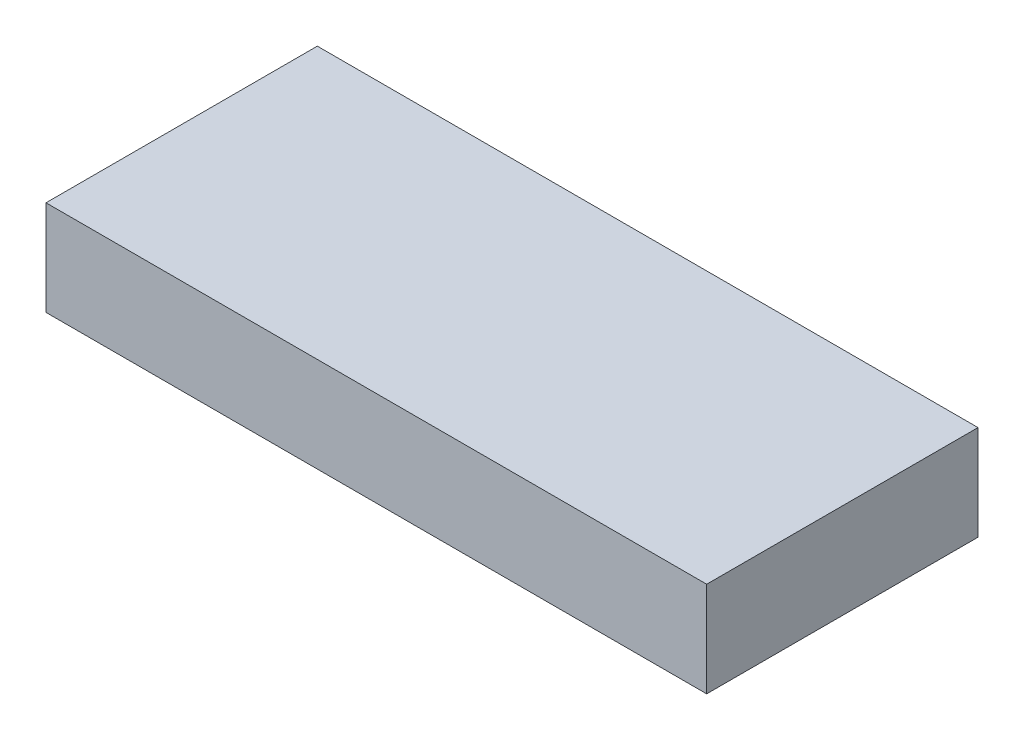
ISO-10303-21;
HEADER;
FILE_DESCRIPTION(('STEP AP214'),'2;1');
FILE_NAME('part.step','',(''),(''),'','','');
FILE_SCHEMA(('AUTOMOTIVE_DESIGN { 1 0 10303 214 1 1 1 1 }'));
ENDSEC;
DATA;
#1=APPLICATION_CONTEXT('core data for automotive mechanical design processes');
#2=APPLICATION_PROTOCOL_DEFINITION('international standard','automotive_design',2000,#1);
#3=PRODUCT_CONTEXT('',#1,'mechanical');
#4=PRODUCT('Part','Part','',(#3));
#5=PRODUCT_RELATED_PRODUCT_CATEGORY('part','',(#4));
#6=PRODUCT_DEFINITION_FORMATION('','',#4);
#7=PRODUCT_DEFINITION_CONTEXT('part definition',#1,'design');
#8=PRODUCT_DEFINITION('design','',#6,#7);
#9=PRODUCT_DEFINITION_SHAPE('','',#8);
#10=(LENGTH_UNIT() NAMED_UNIT(*) SI_UNIT(.MILLI.,.METRE.));
#11=(NAMED_UNIT(*) PLANE_ANGLE_UNIT() SI_UNIT($,.RADIAN.));
#12=(NAMED_UNIT(*) SI_UNIT($,.STERADIAN.) SOLID_ANGLE_UNIT());
#13=UNCERTAINTY_MEASURE_WITH_UNIT(LENGTH_MEASURE(1.E-05),#10,'distance_accuracy_value','');
#14=(GEOMETRIC_REPRESENTATION_CONTEXT(3) GLOBAL_UNCERTAINTY_ASSIGNED_CONTEXT((#13)) GLOBAL_UNIT_ASSIGNED_CONTEXT((#10,
#11,#12)) REPRESENTATION_CONTEXT('',''));
#15=CARTESIAN_POINT('',(0.,0.,0.));
#16=DIRECTION('',(0.,0.,1.));
#17=DIRECTION('',(1.,0.,0.));
#18=AXIS2_PLACEMENT_3D('',#15,#16,#17);
#19=CARTESIAN_POINT('',(0.,5.334,0.));
#20=DIRECTION('',(1.,0.,0.));
#21=DIRECTION('',(0.,0.,-1.));
#22=AXIS2_PLACEMENT_3D('',#19,#20,#21);
#23=PLANE('',#22);
#24=DIRECTION('',(0.,0.,1.));
#25=VECTOR('',#24,1.);
#26=CARTESIAN_POINT('',(0.,0.,0.));
#27=LINE('',#26,#25);
#28=CARTESIAN_POINT('',(0.,0.,-15.24));
#29=VERTEX_POINT('',#28);
#30=CARTESIAN_POINT('',(0.,0.,0.));
#31=VERTEX_POINT('',#30);
#32=EDGE_CURVE('E96',#29,#31,#27,.T.);
#33=ORIENTED_EDGE('',*,*,#32,.T.);
#34=DIRECTION('',(0.,-1.,0.));
#35=VECTOR('',#34,1.);
#36=CARTESIAN_POINT('',(0.,5.334,0.));
#37=LINE('',#36,#35);
#38=CARTESIAN_POINT('',(0.,5.334,0.));
#39=VERTEX_POINT('',#38);
#40=EDGE_CURVE('E11',#39,#31,#37,.T.);
#41=ORIENTED_EDGE('',*,*,#40,.F.);
#42=DIRECTION('',(0.,0.,1.));
#43=VECTOR('',#42,1.);
#44=CARTESIAN_POINT('',(0.,5.334,0.));
#45=LINE('',#44,#43);
#46=CARTESIAN_POINT('',(0.,5.334,-15.24));
#47=VERTEX_POINT('',#46);
#48=EDGE_CURVE('E84',#47,#39,#45,.T.);
#49=ORIENTED_EDGE('',*,*,#48,.F.);
#50=DIRECTION('',(0.,-1.,0.));
#51=VECTOR('',#50,1.);
#52=CARTESIAN_POINT('',(0.,5.334,-15.24));
#53=LINE('',#52,#51);
#54=EDGE_CURVE('E92',#47,#29,#53,.T.);
#55=ORIENTED_EDGE('',*,*,#54,.T.);
#56=EDGE_LOOP('',(#33,#41,#49,#55));
#57=FACE_BOUND('',#56,.T.);
#58=ADVANCED_FACE('F33',(#57),#23,.F.);
#59=CARTESIAN_POINT('',(0.,5.334,0.));
#60=DIRECTION('',(0.,0.,-1.));
#61=DIRECTION('',(-1.,0.,0.));
#62=AXIS2_PLACEMENT_3D('',#59,#60,#61);
#63=PLANE('',#62);
#64=DIRECTION('',(1.,0.,0.));
#65=VECTOR('',#64,1.);
#66=CARTESIAN_POINT('',(0.,0.,0.));
#67=LINE('',#66,#65);
#68=CARTESIAN_POINT('',(37.1094,0.,0.));
#69=VERTEX_POINT('',#68);
#70=EDGE_CURVE('E88',#31,#69,#67,.T.);
#71=ORIENTED_EDGE('',*,*,#70,.T.);
#72=DIRECTION('',(0.,-1.,0.));
#73=VECTOR('',#72,1.);
#74=CARTESIAN_POINT('',(37.1094,5.334,0.));
#75=LINE('',#74,#73);
#76=CARTESIAN_POINT('',(37.1094,5.334,0.));
#77=VERTEX_POINT('',#76);
#78=EDGE_CURVE('E41',#77,#69,#75,.T.);
#79=ORIENTED_EDGE('',*,*,#78,.F.);
#80=DIRECTION('',(1.,0.,0.));
#81=VECTOR('',#80,1.);
#82=CARTESIAN_POINT('',(0.,5.334,0.));
#83=LINE('',#82,#81);
#84=EDGE_CURVE('E79',#39,#77,#83,.T.);
#85=ORIENTED_EDGE('',*,*,#84,.F.);
#86=ORIENTED_EDGE('',*,*,#40,.T.);
#87=EDGE_LOOP('',(#71,#79,#85,#86));
#88=FACE_BOUND('',#87,.T.);
#89=ADVANCED_FACE('F87',(#88),#63,.F.);
#90=CARTESIAN_POINT('',(37.1094,5.334,0.));
#91=DIRECTION('',(-1.,0.,0.));
#92=DIRECTION('',(0.,0.,1.));
#93=AXIS2_PLACEMENT_3D('',#90,#91,#92);
#94=PLANE('',#93);
#95=DIRECTION('',(0.,0.,-1.));
#96=VECTOR('',#95,1.);
#97=CARTESIAN_POINT('',(37.1094,0.,0.));
#98=LINE('',#97,#96);
#99=CARTESIAN_POINT('',(37.1094,0.,-15.24));
#100=VERTEX_POINT('',#99);
#101=EDGE_CURVE('E66',#69,#100,#98,.T.);
#102=ORIENTED_EDGE('',*,*,#101,.T.);
#103=DIRECTION('',(0.,-1.,0.));
#104=VECTOR('',#103,1.);
#105=CARTESIAN_POINT('',(37.1094,5.334,-15.24));
#106=LINE('',#105,#104);
#107=CARTESIAN_POINT('',(37.1094,5.334,-15.24));
#108=VERTEX_POINT('',#107);
#109=EDGE_CURVE('E89',#108,#100,#106,.T.);
#110=ORIENTED_EDGE('',*,*,#109,.F.);
#111=DIRECTION('',(0.,0.,-1.));
#112=VECTOR('',#111,1.);
#113=CARTESIAN_POINT('',(37.1094,5.334,0.));
#114=LINE('',#113,#112);
#115=EDGE_CURVE('E82',#77,#108,#114,.T.);
#116=ORIENTED_EDGE('',*,*,#115,.F.);
#117=ORIENTED_EDGE('',*,*,#78,.T.);
#118=EDGE_LOOP('',(#102,#110,#116,#117));
#119=FACE_BOUND('',#118,.T.);
#120=ADVANCED_FACE('F90',(#119),#94,.F.);
#121=CARTESIAN_POINT('',(0.,5.334,-15.24));
#122=DIRECTION('',(0.,0.,1.));
#123=DIRECTION('',(1.,0.,0.));
#124=AXIS2_PLACEMENT_3D('',#121,#122,#123);
#125=PLANE('',#124);
#126=DIRECTION('',(-1.,0.,0.));
#127=VECTOR('',#126,1.);
#128=CARTESIAN_POINT('',(0.,0.,-15.24));
#129=LINE('',#128,#127);
#130=EDGE_CURVE('E72',#100,#29,#129,.T.);
#131=ORIENTED_EDGE('',*,*,#130,.T.);
#132=ORIENTED_EDGE('',*,*,#54,.F.);
#133=DIRECTION('',(-1.,0.,0.));
#134=VECTOR('',#133,1.);
#135=CARTESIAN_POINT('',(0.,5.334,-15.24));
#136=LINE('',#135,#134);
#137=EDGE_CURVE('E49',#108,#47,#136,.T.);
#138=ORIENTED_EDGE('',*,*,#137,.F.);
#139=ORIENTED_EDGE('',*,*,#109,.T.);
#140=EDGE_LOOP('',(#131,#132,#138,#139));
#141=FACE_BOUND('',#140,.T.);
#142=ADVANCED_FACE('F103',(#141),#125,.F.);
#143=CARTESIAN_POINT('',(0.,5.334,0.));
#144=DIRECTION('',(0.,-1.,0.));
#145=DIRECTION('',(0.,0.,-1.));
#146=AXIS2_PLACEMENT_3D('',#143,#144,#145);
#147=PLANE('',#146);
#148=ORIENTED_EDGE('',*,*,#48,.T.);
#149=ORIENTED_EDGE('',*,*,#84,.T.);
#150=ORIENTED_EDGE('',*,*,#115,.T.);
#151=ORIENTED_EDGE('',*,*,#137,.T.);
#152=EDGE_LOOP('',(#148,#149,#150,#151));
#153=FACE_BOUND('',#152,.T.);
#154=ADVANCED_FACE('F80',(#153),#147,.F.);
#155=CARTESIAN_POINT('',(0.,0.,0.));
#156=DIRECTION('',(0.,-1.,0.));
#157=DIRECTION('',(0.,0.,-1.));
#158=AXIS2_PLACEMENT_3D('',#155,#156,#157);
#159=PLANE('',#158);
#160=ORIENTED_EDGE('',*,*,#32,.F.);
#161=ORIENTED_EDGE('',*,*,#130,.F.);
#162=ORIENTED_EDGE('',*,*,#101,.F.);
#163=ORIENTED_EDGE('',*,*,#70,.F.);
#164=EDGE_LOOP('',(#160,#161,#162,#163));
#165=FACE_BOUND('',#164,.T.);
#166=ADVANCED_FACE('F106',(#165),#159,.T.);
#167=CLOSED_SHELL('',(#58,#89,#120,#142,#154,#166));
#168=MANIFOLD_SOLID_BREP('B2',#167);
#169=ADVANCED_BREP_SHAPE_REPRESENTATION('',(#18,#168),#14);
#170=SHAPE_DEFINITION_REPRESENTATION(#9,#169);
ENDSEC;
END-ISO-10303-21;
